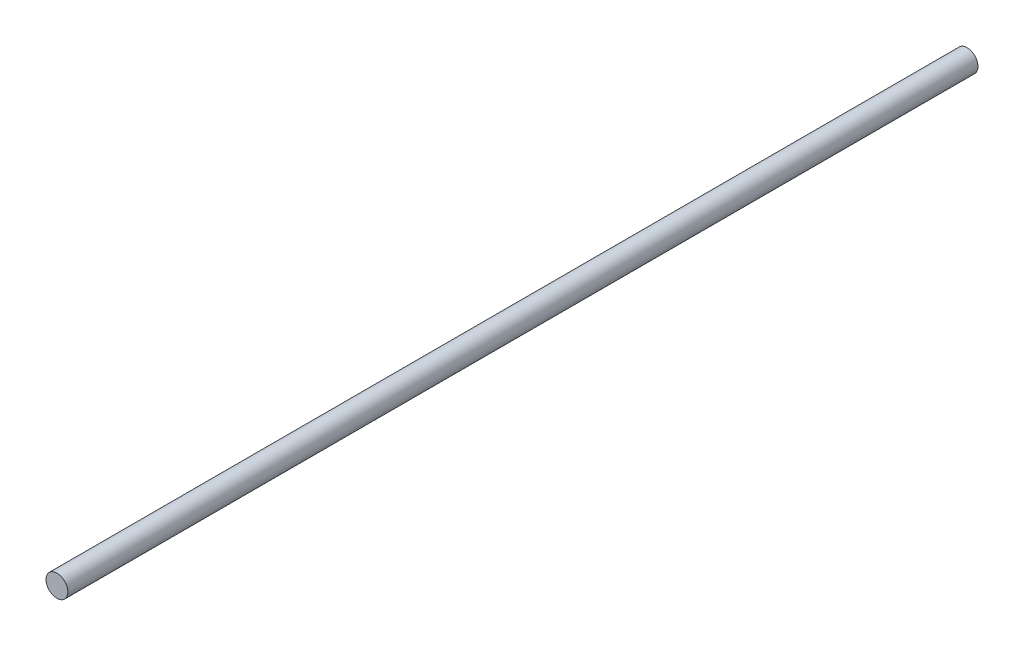
ISO-10303-21;
HEADER;
FILE_DESCRIPTION(('STEP AP214'),'2;1');
FILE_NAME('part.step','',(''),(''),'','','');
FILE_SCHEMA(('AUTOMOTIVE_DESIGN { 1 0 10303 214 1 1 1 1 }'));
ENDSEC;
DATA;
#1=APPLICATION_CONTEXT('core data for automotive mechanical design processes');
#2=APPLICATION_PROTOCOL_DEFINITION('international standard','automotive_design',2000,#1);
#3=PRODUCT_CONTEXT('',#1,'mechanical');
#4=PRODUCT('Part','Part','',(#3));
#5=PRODUCT_RELATED_PRODUCT_CATEGORY('part','',(#4));
#6=PRODUCT_DEFINITION_FORMATION('','',#4);
#7=PRODUCT_DEFINITION_CONTEXT('part definition',#1,'design');
#8=PRODUCT_DEFINITION('design','',#6,#7);
#9=PRODUCT_DEFINITION_SHAPE('','',#8);
#10=(LENGTH_UNIT() NAMED_UNIT(*) SI_UNIT(.MILLI.,.METRE.));
#11=(NAMED_UNIT(*) PLANE_ANGLE_UNIT() SI_UNIT($,.RADIAN.));
#12=(NAMED_UNIT(*) SI_UNIT($,.STERADIAN.) SOLID_ANGLE_UNIT());
#13=UNCERTAINTY_MEASURE_WITH_UNIT(LENGTH_MEASURE(1.E-05),#10,'distance_accuracy_value','');
#14=(GEOMETRIC_REPRESENTATION_CONTEXT(3) GLOBAL_UNCERTAINTY_ASSIGNED_CONTEXT((#13)) GLOBAL_UNIT_ASSIGNED_CONTEXT((#10,
#11,#12)) REPRESENTATION_CONTEXT('',''));
#15=CARTESIAN_POINT('',(0.,0.,0.));
#16=DIRECTION('',(0.,0.,1.));
#17=DIRECTION('',(1.,0.,0.));
#18=AXIS2_PLACEMENT_3D('',#15,#16,#17);
#19=CARTESIAN_POINT('',(0.,0.,175.));
#20=DIRECTION('',(0.,0.,-1.));
#21=DIRECTION('',(-1.,0.,0.));
#22=AXIS2_PLACEMENT_3D('',#19,#20,#21);
#23=CYLINDRICAL_SURFACE('',#22,4.2);
#24=CARTESIAN_POINT('',(0.,0.,175.));
#25=DIRECTION('',(0.,0.,1.));
#26=DIRECTION('',(1.,0.,0.));
#27=AXIS2_PLACEMENT_3D('',#24,#25,#26);
#28=CIRCLE('',#27,4.2);
#29=CARTESIAN_POINT('',(4.2,0.,175.));
#30=VERTEX_POINT('',#29);
#31=EDGE_CURVE('E10',#30,#30,#28,.T.);
#32=ORIENTED_EDGE('',*,*,#31,.F.);
#33=EDGE_LOOP('',(#32));
#34=FACE_BOUND('',#33,.T.);
#35=CARTESIAN_POINT('',(0.,0.,-175.));
#36=DIRECTION('',(0.,0.,1.));
#37=DIRECTION('',(1.,0.,0.));
#38=AXIS2_PLACEMENT_3D('',#35,#36,#37);
#39=CIRCLE('',#38,4.2);
#40=CARTESIAN_POINT('',(4.2,0.,-175.));
#41=VERTEX_POINT('',#40);
#42=EDGE_CURVE('E34',#41,#41,#39,.T.);
#43=ORIENTED_EDGE('',*,*,#42,.T.);
#44=EDGE_LOOP('',(#43));
#45=FACE_BOUND('',#44,.T.);
#46=ADVANCED_FACE('F31',(#34,#45),#23,.T.);
#47=CARTESIAN_POINT('',(0.,0.,175.));
#48=DIRECTION('',(0.,0.,1.));
#49=DIRECTION('',(1.,0.,0.));
#50=AXIS2_PLACEMENT_3D('',#47,#48,#49);
#51=PLANE('',#50);
#52=ORIENTED_EDGE('',*,*,#31,.T.);
#53=EDGE_LOOP('',(#52));
#54=FACE_BOUND('',#53,.T.);
#55=ADVANCED_FACE('F46',(#54),#51,.T.);
#56=CARTESIAN_POINT('',(0.,0.,-175.));
#57=DIRECTION('',(0.,0.,1.));
#58=DIRECTION('',(1.,0.,0.));
#59=AXIS2_PLACEMENT_3D('',#56,#57,#58);
#60=PLANE('',#59);
#61=ORIENTED_EDGE('',*,*,#42,.F.);
#62=EDGE_LOOP('',(#61));
#63=FACE_BOUND('',#62,.T.);
#64=ADVANCED_FACE('F44',(#63),#60,.F.);
#65=CLOSED_SHELL('',(#46,#55,#64));
#66=MANIFOLD_SOLID_BREP('B2',#65);
#67=ADVANCED_BREP_SHAPE_REPRESENTATION('',(#18,#66),#14);
#68=SHAPE_DEFINITION_REPRESENTATION(#9,#67);
ENDSEC;
END-ISO-10303-21;
